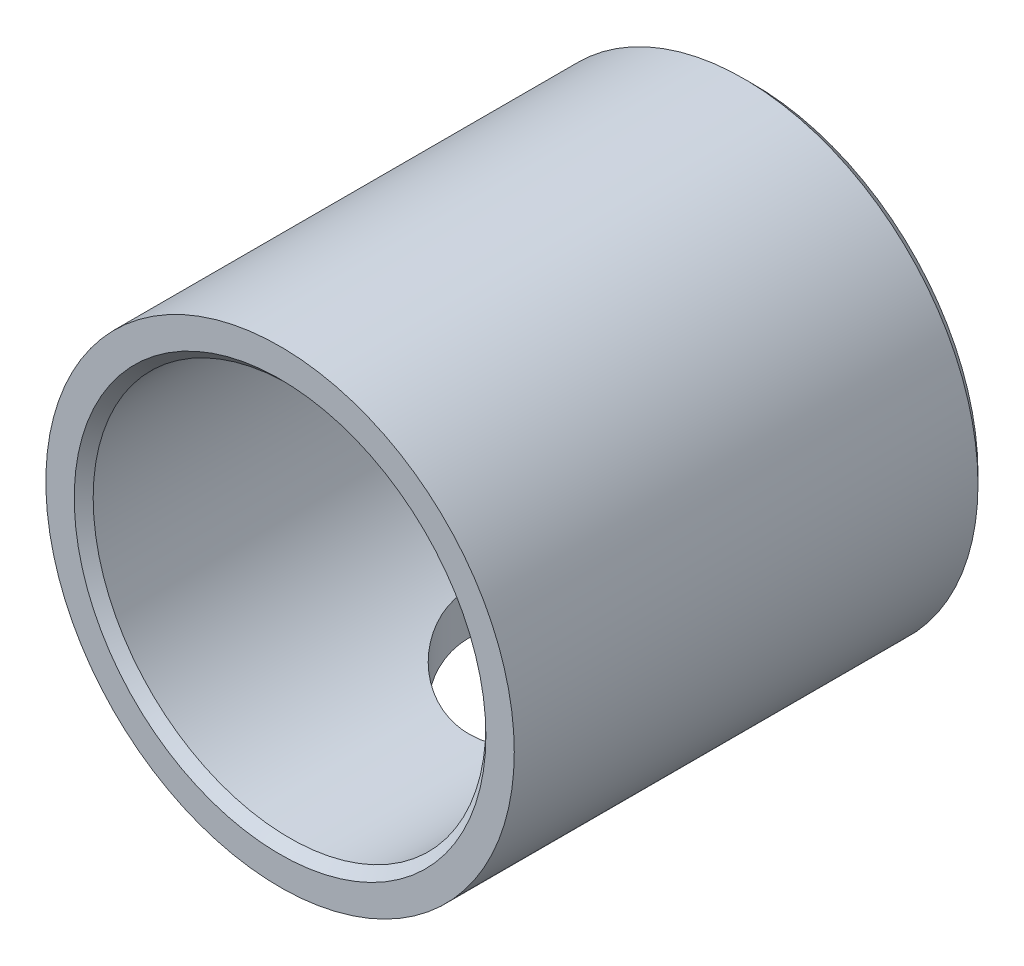
ISO-10303-21;
HEADER;
FILE_DESCRIPTION(('STEP AP214'),'2;1');
FILE_NAME('part.step','',(''),(''),'','','');
FILE_SCHEMA(('AUTOMOTIVE_DESIGN { 1 0 10303 214 1 1 1 1 }'));
ENDSEC;
DATA;
#1=APPLICATION_CONTEXT('core data for automotive mechanical design processes');
#2=APPLICATION_PROTOCOL_DEFINITION('international standard','automotive_design',2000,#1);
#3=PRODUCT_CONTEXT('',#1,'mechanical');
#4=PRODUCT('Part','Part','',(#3));
#5=PRODUCT_RELATED_PRODUCT_CATEGORY('part','',(#4));
#6=PRODUCT_DEFINITION_FORMATION('','',#4);
#7=PRODUCT_DEFINITION_CONTEXT('part definition',#1,'design');
#8=PRODUCT_DEFINITION('design','',#6,#7);
#9=PRODUCT_DEFINITION_SHAPE('','',#8);
#10=(LENGTH_UNIT() NAMED_UNIT(*) SI_UNIT(.MILLI.,.METRE.));
#11=(NAMED_UNIT(*) PLANE_ANGLE_UNIT() SI_UNIT($,.RADIAN.));
#12=(NAMED_UNIT(*) SI_UNIT($,.STERADIAN.) SOLID_ANGLE_UNIT());
#13=UNCERTAINTY_MEASURE_WITH_UNIT(LENGTH_MEASURE(1.E-05),#10,'distance_accuracy_value','');
#14=(GEOMETRIC_REPRESENTATION_CONTEXT(3) GLOBAL_UNCERTAINTY_ASSIGNED_CONTEXT((#13)) GLOBAL_UNIT_ASSIGNED_CONTEXT((#10,
#11,#12)) REPRESENTATION_CONTEXT('',''));
#15=CARTESIAN_POINT('',(0.,0.,0.));
#16=DIRECTION('',(0.,0.,1.));
#17=DIRECTION('',(1.,0.,0.));
#18=AXIS2_PLACEMENT_3D('',#15,#16,#17);
#19=CARTESIAN_POINT('',(0.,0.,10.));
#20=DIRECTION('',(0.,0.,1.));
#21=DIRECTION('',(1.,0.,0.));
#22=AXIS2_PLACEMENT_3D('',#19,#20,#21);
#23=PLANE('',#22);
#24=CARTESIAN_POINT('',(0.,0.,10.));
#25=DIRECTION('',(0.,0.,1.));
#26=DIRECTION('',(1.,0.,0.));
#27=AXIS2_PLACEMENT_3D('',#24,#25,#26);
#28=CIRCLE('',#27,4.35);
#29=CARTESIAN_POINT('',(4.35,0.,10.));
#30=VERTEX_POINT('',#29);
#31=EDGE_CURVE('E10',#30,#30,#28,.F.);
#32=ORIENTED_EDGE('',*,*,#31,.T.);
#33=EDGE_LOOP('',(#32));
#34=FACE_BOUND('',#33,.T.);
#35=CARTESIAN_POINT('',(0.,0.,10.));
#36=DIRECTION('',(0.,0.,1.));
#37=DIRECTION('',(1.,0.,0.));
#38=AXIS2_PLACEMENT_3D('',#35,#36,#37);
#39=CIRCLE('',#38,4.95);
#40=CARTESIAN_POINT('',(4.95,0.,10.));
#41=VERTEX_POINT('',#40);
#42=EDGE_CURVE('E76',#41,#41,#39,.T.);
#43=ORIENTED_EDGE('',*,*,#42,.T.);
#44=EDGE_LOOP('',(#43));
#45=FACE_BOUND('',#44,.T.);
#46=ADVANCED_FACE('F38',(#34,#45),#23,.T.);
#47=CARTESIAN_POINT('',(0.,0.,0.));
#48=DIRECTION('',(0.,0.,1.));
#49=DIRECTION('',(1.,0.,0.));
#50=AXIS2_PLACEMENT_3D('',#47,#48,#49);
#51=PLANE('',#50);
#52=CARTESIAN_POINT('',(0.,0.,0.));
#53=DIRECTION('',(0.,0.,1.));
#54=DIRECTION('',(1.,0.,0.));
#55=AXIS2_PLACEMENT_3D('',#52,#53,#54);
#56=CIRCLE('',#55,4.35);
#57=CARTESIAN_POINT('',(4.35,0.,0.));
#58=VERTEX_POINT('',#57);
#59=EDGE_CURVE('E68',#58,#58,#56,.T.);
#60=ORIENTED_EDGE('',*,*,#59,.T.);
#61=EDGE_LOOP('',(#60));
#62=FACE_BOUND('',#61,.T.);
#63=CARTESIAN_POINT('',(0.,0.,0.));
#64=DIRECTION('',(0.,0.,1.));
#65=DIRECTION('',(1.,0.,0.));
#66=AXIS2_PLACEMENT_3D('',#63,#64,#65);
#67=CIRCLE('',#66,4.75);
#68=CARTESIAN_POINT('',(4.75,0.,0.));
#69=VERTEX_POINT('',#68);
#70=EDGE_CURVE('E72',#69,#69,#67,.F.);
#71=ORIENTED_EDGE('',*,*,#70,.T.);
#72=EDGE_LOOP('',(#71));
#73=FACE_BOUND('',#72,.T.);
#74=ADVANCED_FACE('F103',(#62,#73),#51,.F.);
#75=CARTESIAN_POINT('',(0.,0.,10.));
#76=DIRECTION('',(0.,0.,-1.));
#77=DIRECTION('',(-1.,0.,0.));
#78=AXIS2_PLACEMENT_3D('',#75,#76,#77);
#79=CYLINDRICAL_SURFACE('',#78,4.95);
#80=CARTESIAN_POINT('',(0.,-4.95,6.));
#81=CARTESIAN_POINT('',(0.112301582647783,-4.9499965515608,5.99999567464659));
#82=CARTESIAN_POINT('',(0.224792481550296,-4.94613509187911,5.99093874290811));
#83=CARTESIAN_POINT('',(0.446566600657555,-4.93107490183744,5.95505657967135));
#84=CARTESIAN_POINT('',(0.555840873563384,-4.91985741642461,5.92818592807662));
#85=CARTESIAN_POINT('',(0.767621940121258,-4.89128147335943,5.85784547668171));
#86=CARTESIAN_POINT('',(0.87015059406843,-4.87394414245908,5.81443274250477));
#87=CARTESIAN_POINT('',(1.06636670809899,-4.83480967718871,5.71248297058019));
#88=CARTESIAN_POINT('',(1.16005665634095,-4.81301380343716,5.65395020667717));
#89=CARTESIAN_POINT('',(1.34092886822163,-4.76587393170104,5.52023091803489));
#90=CARTESIAN_POINT('',(1.427594991161,-4.74041099553475,5.4443885549482));
#91=CARTESIAN_POINT('',(1.58742453001564,-4.68931102061471,5.27959114690587));
#92=CARTESIAN_POINT('',(1.66058059271675,-4.66367389487739,5.19062900825565));
#93=CARTESIAN_POINT('',(1.79503722994001,-4.61364895522852,4.99657432733226));
#94=CARTESIAN_POINT('',(1.85553434695824,-4.58939325063096,4.89088742491093));
#95=CARTESIAN_POINT('',(1.95766207414076,-4.54677296022365,4.66966165832132));
#96=CARTESIAN_POINT('',(1.99930275422277,-4.52840523158807,4.55412809183853));
#97=CARTESIAN_POINT('',(2.06038430301055,-4.5009326477947,4.32243046686182));
#98=CARTESIAN_POINT('',(2.08082052823899,-4.49141490532564,4.20657970073457));
#99=CARTESIAN_POINT('',(2.10201608926006,-4.48153766415102,3.97273264015104));
#100=CARTESIAN_POINT('',(2.10278685716824,-4.48117284458106,3.85473763213555));
#101=CARTESIAN_POINT('',(2.0853772907639,-4.48929455208447,3.63003785984406));
#102=CARTESIAN_POINT('',(2.06870861766495,-4.49707506998191,3.52318524814031));
#103=CARTESIAN_POINT('',(2.01943598065263,-4.51941392363577,3.3139680635675));
#104=CARTESIAN_POINT('',(1.98682883112054,-4.5339736143159,3.21160439236052));
#105=CARTESIAN_POINT('',(1.9059644569969,-4.56856233704123,3.01163753293327));
#106=CARTESIAN_POINT('',(1.85738389198919,-4.58870288789942,2.91418526021791));
#107=CARTESIAN_POINT('',(1.74618123248654,-4.63216032487414,2.72842780144531));
#108=CARTESIAN_POINT('',(1.68355348954503,-4.65547848724117,2.6401263159099));
#109=CARTESIAN_POINT('',(1.53957397416966,-4.70515656408564,2.46700558869798));
#110=CARTESIAN_POINT('',(1.45706010278065,-4.73160366308508,2.3831750455458));
#111=CARTESIAN_POINT('',(1.27889286097636,-4.78283596193983,2.23020270177476));
#112=CARTESIAN_POINT('',(1.18323619466962,-4.8076207425989,2.16106459677072));
#113=CARTESIAN_POINT('',(0.978400097492738,-4.85350415487625,2.03791658059401));
#114=CARTESIAN_POINT('',(0.86894479347238,-4.87449649479429,1.9843229802628));
#115=CARTESIAN_POINT('',(0.641453320719071,-4.90960783714911,1.89665959690019));
#116=CARTESIAN_POINT('',(0.523422116843703,-4.92373078062278,1.86257861730367));
#117=CARTESIAN_POINT('',(0.290379608017288,-4.94276746686856,1.81700999179039));
#118=CARTESIAN_POINT('',(0.175671644051868,-4.94822070764765,1.80419636869434));
#119=CARTESIAN_POINT('',(-0.0543764283818428,-4.95103620786265,1.79755548754529));
#120=CARTESIAN_POINT('',(-0.16971633639105,-4.94840089977835,1.80372252141624));
#121=CARTESIAN_POINT('',(-0.391450985718725,-4.93568347309362,1.8339313305913));
#122=CARTESIAN_POINT('',(-0.497999430475195,-4.9259946103179,1.85702959174992));
#123=CARTESIAN_POINT('',(-0.705584395649269,-4.90057070908498,1.9191182769197));
#124=CARTESIAN_POINT('',(-0.806620224411352,-4.88483491391582,1.95811068995908));
#125=CARTESIAN_POINT('',(-1.00387399639965,-4.8482078089547,2.05215024419884));
#126=CARTESIAN_POINT('',(-1.09984342824605,-4.82717102462015,2.10766014142646));
#127=CARTESIAN_POINT('',(-1.28145048756228,-4.78217022744801,2.23265211316484));
#128=CARTESIAN_POINT('',(-1.36708371235184,-4.7582049759225,2.30214010824093));
#129=CARTESIAN_POINT('',(-1.53224968098203,-4.70772889844698,2.45912141858762));
#130=CARTESIAN_POINT('',(-1.6108628985773,-4.68116088911202,2.5475662669057));
#131=CARTESIAN_POINT('',(-1.75240207998206,-4.6300392859366,2.73679292301585));
#132=CARTESIAN_POINT('',(-1.81532398236708,-4.60548621472895,2.83757791479607));
#133=CARTESIAN_POINT('',(-1.92451755642478,-4.56095184540823,3.05098576686144));
#134=CARTESIAN_POINT('',(-1.97049632620522,-4.54105296578658,3.16377698676157));
#135=CARTESIAN_POINT('',(-2.04240400736573,-4.50917525572841,3.39661381638421));
#136=CARTESIAN_POINT('',(-2.06835027279071,-4.49718957144286,3.51665304976));
#137=CARTESIAN_POINT('',(-2.09770229332542,-4.48356809624516,3.75033735405643));
#138=CARTESIAN_POINT('',(-2.10273024271449,-4.48118789605524,3.86373605949893));
#139=CARTESIAN_POINT('',(-2.0944660610553,-4.48505675748601,4.08970184234622));
#140=CARTESIAN_POINT('',(-2.08117700105338,-4.49130437255973,4.20226905597869));
#141=CARTESIAN_POINT('',(-2.0380350566449,-4.511033967418,4.41756156365122));
#142=CARTESIAN_POINT('',(-2.00904391951625,-4.52413846348461,4.52049750923513));
#143=CARTESIAN_POINT('',(-1.93618070006163,-4.55579560561135,4.72005887815907));
#144=CARTESIAN_POINT('',(-1.89230440489335,-4.57434979386004,4.81668250572486));
#145=CARTESIAN_POINT('',(-1.78782295675972,-4.61622540946159,5.00734928626691));
#146=CARTESIAN_POINT('',(-1.72635696018345,-4.63976939997878,5.1008708717399));
#147=CARTESIAN_POINT('',(-1.58962247889317,-4.68837512915063,5.27677929186298));
#148=CARTESIAN_POINT('',(-1.51434893116305,-4.71343742227834,5.35916202275475));
#149=CARTESIAN_POINT('',(-1.34529276621933,-4.76456289829524,5.51695914074286));
#150=CARTESIAN_POINT('',(-1.250533580177,-4.79055551308195,5.59135511321612));
#151=CARTESIAN_POINT('',(-1.04892325142446,-4.83869670451416,5.72325699510692));
#152=CARTESIAN_POINT('',(-0.942066652038278,-4.86084353497093,5.78075524022718));
#153=CARTESIAN_POINT('',(-0.720791949594844,-4.89850604594642,5.87604454140452));
#154=CARTESIAN_POINT('',(-0.606514897009996,-4.91411818847802,5.91412422979565));
#155=CARTESIAN_POINT('',(-0.372560586424519,-4.93734930142461,5.97016415476899));
#156=CARTESIAN_POINT('',(-0.252901343176279,-4.94499312789743,5.98818696794812));
#157=CARTESIAN_POINT('',(-0.110610505335222,-4.94881414599948,5.99720274383913));
#158=CARTESIAN_POINT('',(-0.0885056856776281,-4.94925816176932,5.99825084640251));
#159=CARTESIAN_POINT('',(-0.0442696965048835,-4.94985142939519,5.9996499025296));
#160=CARTESIAN_POINT('',(-0.0221385268611318,-4.95000067980666,6.00000085267679));
#161=CARTESIAN_POINT('',(0.,-4.95,6.));
#162=B_SPLINE_CURVE_WITH_KNOTS('',3,(#80,#81,#82,#83,#84,#85,#86,#87,#88,#89,#90,#91,#92,#93,
#94,#95,#96,#97,#98,#99,#100,#101,#102,#103,#104,#105,#106,#107,#108,#109,#110,#111,#112,#113,
#114,#115,#116,#117,#118,#119,#120,#121,#122,#123,#124,#125,#126,#127,#128,#129,#130,#131,#132,
#133,#134,#135,#136,#137,#138,#139,#140,#141,#142,#143,#144,#145,#146,#147,#148,#149,#150,#151,
#152,#153,#154,#155,#156,#157,#158,#159,#160,#161),.UNSPECIFIED.,.T.,.F.,(4,2,2,2,2,2,2,2,2,2,2,
2,2,2,2,2,2,2,2,2,2,2,2,2,2,2,2,2,2,2,2,2,2,2,2,2,2,2,2,2,4),(0.,0.336813208358849,
0.674488517977698,1.01100933524133,1.34743513503938,1.69974574939141,2.05224755675095,
2.42288269119058,2.7933196609631,3.14545081571036,3.49737726147137,3.82114013439841,
4.14496774419449,4.47580167307256,4.8067688713215,5.16683428185757,5.52699015336108,
5.89605088565671,6.26489963388814,6.60974472488548,6.95448612033346,7.28135026851043,
7.60825533373116,7.94535516416504,8.28259807844334,8.64478193228799,9.00705943406149,
9.37533468047069,9.74329053303778,10.0821095237284,10.4208717146304,10.742689483683,
11.0645984106616,11.4062471098677,11.7480213377301,12.1159973417581,12.4841399918707,
12.8466383232548,13.2080024765513,13.2743996861241,13.3407972210887),.UNSPECIFIED.);
#163=CARTESIAN_POINT('',(0.,-4.95,6.));
#164=VERTEX_POINT('',#163);
#165=EDGE_CURVE('E80',#164,#164,#162,.T.);
#166=ORIENTED_EDGE('',*,*,#165,.T.);
#167=EDGE_LOOP('',(#166));
#168=FACE_BOUND('',#167,.T.);
#169=CARTESIAN_POINT('',(0.,0.,0.199999999999999));
#170=DIRECTION('',(0.,0.,1.));
#171=DIRECTION('',(1.,0.,0.));
#172=AXIS2_PLACEMENT_3D('',#169,#170,#171);
#173=CIRCLE('',#172,4.95);
#174=CARTESIAN_POINT('',(4.95,0.,0.199999999999999));
#175=VERTEX_POINT('',#174);
#176=EDGE_CURVE('E53',#175,#175,#173,.T.);
#177=ORIENTED_EDGE('',*,*,#176,.T.);
#178=EDGE_LOOP('',(#177));
#179=FACE_BOUND('',#178,.T.);
#180=ORIENTED_EDGE('',*,*,#42,.F.);
#181=EDGE_LOOP('',(#180));
#182=FACE_BOUND('',#181,.T.);
#183=ADVANCED_FACE('F87',(#168,#179,#182),#79,.T.);
#184=CARTESIAN_POINT('',(0.,0.,10.));
#185=DIRECTION('',(0.,0.,-1.));
#186=DIRECTION('',(-1.,0.,0.));
#187=AXIS2_PLACEMENT_3D('',#184,#185,#186);
#188=CYLINDRICAL_SURFACE('',#187,4.15);
#189=CARTESIAN_POINT('',(0.,-4.15,6.));
#190=CARTESIAN_POINT('',(0.110238161173148,-4.14999294750283,5.99999174436947));
#191=CARTESIAN_POINT('',(0.220607763704542,-4.14556022348775,5.99126796748191));
#192=CARTESIAN_POINT('',(0.438072312580816,-4.1282623964397,5.95676056482259));
#193=CARTESIAN_POINT('',(0.545160860900906,-4.11538179514594,5.93094558313612));
#194=CARTESIAN_POINT('',(0.752590906304818,-4.08253504412975,5.86353067021785));
#195=CARTESIAN_POINT('',(0.852957042631683,-4.06259666873423,5.82199257007719));
#196=CARTESIAN_POINT('',(1.04514103844507,-4.01745430099871,5.72463573721932));
#197=CARTESIAN_POINT('',(1.1369594380806,-3.99225064170977,5.66881790770413));
#198=CARTESIAN_POINT('',(1.31579602505953,-3.93706344342056,5.54058583874125));
#199=CARTESIAN_POINT('',(1.40217130660823,-3.90688122531567,5.46736178767381));
#200=CARTESIAN_POINT('',(1.56200990721387,-3.84577185312206,5.30814316972267));
#201=CARTESIAN_POINT('',(1.63546312998512,-3.81484413782237,5.22213871315679));
#202=CARTESIAN_POINT('',(1.77326451657112,-3.75289064474626,5.03156391637506));
#203=CARTESIAN_POINT('',(1.83641582709839,-3.72205457525572,4.9260591152359));
#204=CARTESIAN_POINT('',(1.94381193200399,-3.66711845455576,4.70420811361677));
#205=CARTESIAN_POINT('',(1.98807046424644,-3.64301351323966,4.58786986590979));
#206=CARTESIAN_POINT('',(2.05350619124438,-3.60651482216827,4.35480966485954));
#207=CARTESIAN_POINT('',(2.07591712390734,-3.59350111564596,4.23853619360883));
#208=CARTESIAN_POINT('',(2.10078710795464,-3.57902575484963,4.00321240759569));
#209=CARTESIAN_POINT('',(2.10326675583502,-3.57755217533469,3.88416508692023));
#210=CARTESIAN_POINT('',(2.08910778296228,-3.58582728746895,3.6624558201884));
#211=CARTESIAN_POINT('',(2.07478733976487,-3.59421550140011,3.55958243516551));
#212=CARTESIAN_POINT('',(2.0314608694526,-3.61887854117373,3.35796323346001));
#213=CARTESIAN_POINT('',(2.00244996982594,-3.63515598362858,3.2592187980336));
#214=CARTESIAN_POINT('',(1.93004934851676,-3.6741154829412,3.06583876950806));
#215=CARTESIAN_POINT('',(1.88634125882569,-3.69693753653864,2.97135191270322));
#216=CARTESIAN_POINT('',(1.78603384056713,-3.74642602618853,2.79059481542412));
#217=CARTESIAN_POINT('',(1.72942871640225,-3.77309418860049,2.70432829375106));
#218=CARTESIAN_POINT('',(1.59633858021707,-3.83146683912517,2.5306277955945));
#219=CARTESIAN_POINT('',(1.51822431916809,-3.86337480595741,2.44450611835556));
#220=CARTESIAN_POINT('',(1.34854995768411,-3.92582317940521,2.28603053265937));
#221=CARTESIAN_POINT('',(1.25698317065106,-3.95636289602169,2.21368351221338));
#222=CARTESIAN_POINT('',(1.05737448728489,-4.0144445515143,2.08149414078721));
#223=CARTESIAN_POINT('',(0.948747952957727,-4.04176848767434,2.02243097750602));
#224=CARTESIAN_POINT('',(0.721369186730691,-4.08846575307896,1.92390728460076));
#225=CARTESIAN_POINT('',(0.602625269007652,-4.10784553592345,1.88443083778849));
#226=CARTESIAN_POINT('',(0.369093016374065,-4.1350828770617,1.82951067496217));
#227=CARTESIAN_POINT('',(0.254812617748861,-4.14377277041299,1.81232420422026));
#228=CARTESIAN_POINT('',(0.024677019696254,-4.15152020610553,1.79698545176248));
#229=CARTESIAN_POINT('',(-0.0911773784047826,-4.15058247896415,1.79882382222201));
#230=CARTESIAN_POINT('',(-0.311333495807989,-4.13965661414306,1.82049840468657));
#231=CARTESIAN_POINT('',(-0.415819302576405,-4.1303967381464,1.83888654804161));
#232=CARTESIAN_POINT('',(-0.620004362533571,-4.10471524266791,1.89084695752364));
#233=CARTESIAN_POINT('',(-0.719703092355279,-4.08829284208351,1.92442087973664));
#234=CARTESIAN_POINT('',(-0.914733047315155,-4.04918997313302,2.00664807457021));
#235=CARTESIAN_POINT('',(-1.00986327728519,-4.02634686387181,2.05569796448589));
#236=CARTESIAN_POINT('',(-1.19085124016538,-3.97658107687097,2.1670327385841));
#237=CARTESIAN_POINT('',(-1.2767050454463,-3.94965668262241,2.22932319594663));
#238=CARTESIAN_POINT('',(-1.44581203119874,-3.89113236571936,2.37255047043253));
#239=CARTESIAN_POINT('',(-1.52794674238201,-3.85933412945904,2.45472897787576));
#240=CARTESIAN_POINT('',(-1.6777779280981,-3.79660013000065,2.63172549038798));
#241=CARTESIAN_POINT('',(-1.74546381421523,-3.76566501364873,2.72655268256783));
#242=CARTESIAN_POINT('',(-1.86778579798248,-3.70657960724108,2.93231151233551));
#243=CARTESIAN_POINT('',(-1.92156752065922,-3.67865561598439,3.04382190459257));
#244=CARTESIAN_POINT('',(-2.00902739179161,-3.63164010543208,3.2761700718043));
#245=CARTESIAN_POINT('',(-2.04273203427683,-3.61253695354131,3.39699531572443));
#246=CARTESIAN_POINT('',(-2.08592383162365,-3.58775510774848,3.63206498847572));
#247=CARTESIAN_POINT('',(-2.09743731648647,-3.58095708310183,3.74581627400956));
#248=CARTESIAN_POINT('',(-2.10179296154567,-3.57840497389594,3.9737779578067));
#249=CARTESIAN_POINT('',(-2.09464389509152,-3.58264569996756,4.08798811514814));
#250=CARTESIAN_POINT('',(-2.06378278284565,-3.60049409441765,4.30159687304513));
#251=CARTESIAN_POINT('',(-2.0417936449158,-3.61312543224249,4.40133669788672));
#252=CARTESIAN_POINT('',(-1.9840438898351,-3.64515481449483,4.59558942667854));
#253=CARTESIAN_POINT('',(-1.94827875292782,-3.6645550795373,4.69010060351519));
#254=CARTESIAN_POINT('',(-1.86131973951894,-3.70951895935803,4.87823339411685));
#255=CARTESIAN_POINT('',(-1.80925273716972,-3.73540841402403,4.97137121020388));
#256=CARTESIAN_POINT('',(-1.69211642830718,-3.78990978306132,5.14820072887566));
#257=CARTESIAN_POINT('',(-1.62704027608689,-3.81852312663419,5.23188742162871));
#258=CARTESIAN_POINT('',(-1.47615074098068,-3.87954767691452,5.39837390774217));
#259=CARTESIAN_POINT('',(-1.38875957765373,-3.91198467603085,5.4797431958131));
#260=CARTESIAN_POINT('',(-1.20072798760129,-3.97373369269565,5.62700054470837));
#261=CARTESIAN_POINT('',(-1.10008025259927,-4.00304397024901,5.69288000987129));
#262=CARTESIAN_POINT('',(-0.886537963772822,-4.0556996040937,5.80757246091817));
#263=CARTESIAN_POINT('',(-0.773533043426071,-4.07898368034615,5.85621184339317));
#264=CARTESIAN_POINT('',(-0.598214812475302,-4.10708742904303,5.91393547842923));
#265=CARTESIAN_POINT('',(-0.538849744979289,-4.11531496569462,5.93063119303687));
#266=CARTESIAN_POINT('',(-0.418614027723427,-4.12927496582395,5.95877746036203));
#267=CARTESIAN_POINT('',(-0.357744306239514,-4.13500892898637,5.97023116594589));
#268=CARTESIAN_POINT('',(-0.247408070395975,-4.14291006806981,5.98596248439333));
#269=CARTESIAN_POINT('',(-0.198113429714865,-4.14556296471479,5.99122067680186));
#270=CARTESIAN_POINT('',(-0.0992214098179213,-4.14910954200164,5.99824134038535));
#271=CARTESIAN_POINT('',(-0.049624022388861,-4.1500031747017,6.00000371629561));
#272=CARTESIAN_POINT('',(0.,-4.15,6.));
#273=B_SPLINE_CURVE_WITH_KNOTS('',3,(#189,#190,#191,#192,#193,#194,#195,#196,#197,#198,#199,
#200,#201,#202,#203,#204,#205,#206,#207,#208,#209,#210,#211,#212,#213,#214,#215,#216,#217,#218,
#219,#220,#221,#222,#223,#224,#225,#226,#227,#228,#229,#230,#231,#232,#233,#234,#235,#236,#237,
#238,#239,#240,#241,#242,#243,#244,#245,#246,#247,#248,#249,#250,#251,#252,#253,#254,#255,#256,
#257,#258,#259,#260,#261,#262,#263,#264,#265,#266,#267,#268,#269,#270,#271,#272),.UNSPECIFIED.,
.T.,.F.,(4,2,2,2,2,2,2,2,2,2,2,2,2,2,2,2,2,2,2,2,2,2,2,2,2,2,2,2,2,2,2,2,2,2,2,2,2,2,2,2,2,4),
(0.,0.330521695521807,0.661651460275994,0.99149236377812,1.32131240978844,1.67142484294779,
2.02180962325385,2.40019742549864,2.77830961280844,3.13356063833205,3.48844450898765,
3.79959818150547,4.1108551247397,4.429342643393,4.74797356545747,5.10811877527325,
5.46844360526855,5.84629091789196,6.22383066707551,6.56960170704903,6.91520286105725,
7.23322250966046,7.55127684828059,7.87825399851066,8.20536905248936,8.5651934403631,
8.92528061703104,9.30396245559866,9.68214346623987,10.023761480697,10.36521892791,
10.672623264352,10.9801285428616,11.3082352293337,11.636515029576,12.006010632461,
12.3757107956226,12.7490345207904,12.9354401770303,13.1217335696357,13.270514798345,
13.4193000814451),.UNSPECIFIED.);
#274=CARTESIAN_POINT('',(0.,-4.15,6.));
#275=VERTEX_POINT('',#274);
#276=EDGE_CURVE('E43',#275,#275,#273,.T.);
#277=ORIENTED_EDGE('',*,*,#276,.F.);
#278=EDGE_LOOP('',(#277));
#279=FACE_BOUND('',#278,.T.);
#280=CARTESIAN_POINT('',(0.,0.,0.200000000000002));
#281=DIRECTION('',(0.,0.,1.));
#282=DIRECTION('',(1.,0.,0.));
#283=AXIS2_PLACEMENT_3D('',#280,#281,#282);
#284=CIRCLE('',#283,4.15);
#285=CARTESIAN_POINT('',(4.15,0.,0.200000000000002));
#286=VERTEX_POINT('',#285);
#287=EDGE_CURVE('E58',#286,#286,#284,.F.);
#288=ORIENTED_EDGE('',*,*,#287,.T.);
#289=EDGE_LOOP('',(#288));
#290=FACE_BOUND('',#289,.T.);
#291=CARTESIAN_POINT('',(0.,0.,9.8));
#292=DIRECTION('',(0.,0.,1.));
#293=DIRECTION('',(1.,0.,0.));
#294=AXIS2_PLACEMENT_3D('',#291,#292,#293);
#295=CIRCLE('',#294,4.15);
#296=CARTESIAN_POINT('',(4.15,0.,9.8));
#297=VERTEX_POINT('',#296);
#298=EDGE_CURVE('E64',#297,#297,#295,.T.);
#299=ORIENTED_EDGE('',*,*,#298,.T.);
#300=EDGE_LOOP('',(#299));
#301=FACE_BOUND('',#300,.T.);
#302=ADVANCED_FACE('F95',(#279,#290,#301),#188,.F.);
#303=CARTESIAN_POINT('',(0.,0.,0.));
#304=DIRECTION('',(0.,0.,-1.));
#305=DIRECTION('',(-1.,0.,0.));
#306=AXIS2_PLACEMENT_3D('',#303,#304,#305);
#307=CONICAL_SURFACE('',#306,4.35,0.785398163397446);
#308=ORIENTED_EDGE('',*,*,#287,.F.);
#309=EDGE_LOOP('',(#308));
#310=FACE_BOUND('',#309,.T.);
#311=ORIENTED_EDGE('',*,*,#59,.F.);
#312=EDGE_LOOP('',(#311));
#313=FACE_BOUND('',#312,.T.);
#314=ADVANCED_FACE('F100',(#310,#313),#307,.F.);
#315=CARTESIAN_POINT('',(0.,0.,0.199999999999999));
#316=DIRECTION('',(0.,0.,1.));
#317=DIRECTION('',(1.,0.,0.));
#318=AXIS2_PLACEMENT_3D('',#315,#316,#317);
#319=CONICAL_SURFACE('',#318,4.95,0.78539816339745);
#320=ORIENTED_EDGE('',*,*,#70,.F.);
#321=EDGE_LOOP('',(#320));
#322=FACE_BOUND('',#321,.T.);
#323=ORIENTED_EDGE('',*,*,#176,.F.);
#324=EDGE_LOOP('',(#323));
#325=FACE_BOUND('',#324,.T.);
#326=ADVANCED_FACE('F115',(#322,#325),#319,.T.);
#327=CARTESIAN_POINT('',(0.,0.,9.8));
#328=DIRECTION('',(0.,0.,1.));
#329=DIRECTION('',(1.,0.,0.));
#330=AXIS2_PLACEMENT_3D('',#327,#328,#329);
#331=CONICAL_SURFACE('',#330,4.15,0.785398163397446);
#332=ORIENTED_EDGE('',*,*,#31,.F.);
#333=EDGE_LOOP('',(#332));
#334=FACE_BOUND('',#333,.T.);
#335=ORIENTED_EDGE('',*,*,#298,.F.);
#336=EDGE_LOOP('',(#335));
#337=FACE_BOUND('',#336,.T.);
#338=ADVANCED_FACE('F41',(#334,#337),#331,.F.);
#339=CARTESIAN_POINT('',(0.,-4.95,3.9));
#340=DIRECTION('',(0.,1.,0.));
#341=DIRECTION('',(0.,0.,1.));
#342=AXIS2_PLACEMENT_3D('',#339,#340,#341);
#343=CYLINDRICAL_SURFACE('',#342,2.1);
#344=ORIENTED_EDGE('',*,*,#276,.T.);
#345=EDGE_LOOP('',(#344));
#346=FACE_BOUND('',#345,.T.);
#347=ORIENTED_EDGE('',*,*,#165,.F.);
#348=EDGE_LOOP('',(#347));
#349=FACE_BOUND('',#348,.T.);
#350=ADVANCED_FACE('F91',(#346,#349),#343,.F.);
#351=CLOSED_SHELL('',(#46,#74,#183,#302,#314,#326,#338,#350));
#352=MANIFOLD_SOLID_BREP('B2',#351);
#353=ADVANCED_BREP_SHAPE_REPRESENTATION('',(#18,#352),#14);
#354=SHAPE_DEFINITION_REPRESENTATION(#9,#353);
ENDSEC;
END-ISO-10303-21;
